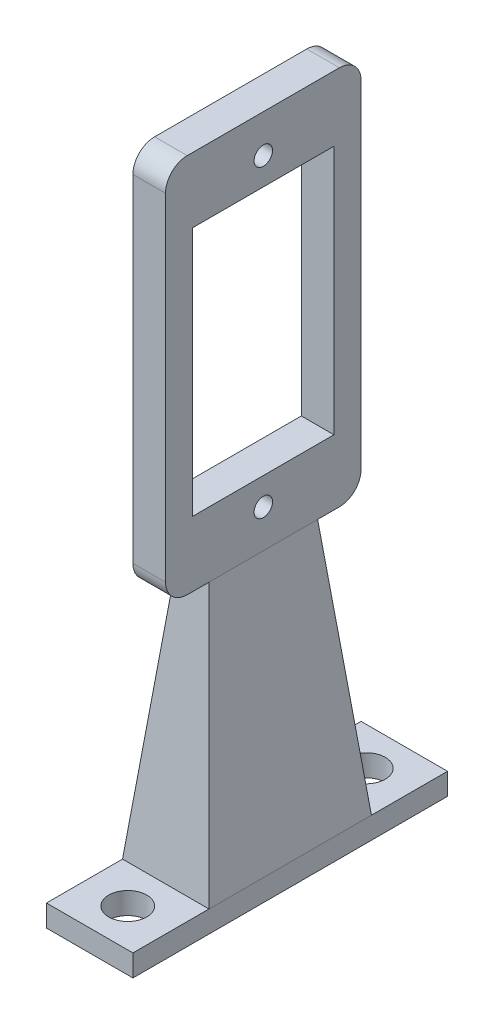
ISO-10303-21;
HEADER;
FILE_DESCRIPTION(('STEP AP214'),'2;1');
FILE_NAME('part.step','',(''),(''),'','','');
FILE_SCHEMA(('AUTOMOTIVE_DESIGN { 1 0 10303 214 1 1 1 1 }'));
ENDSEC;
DATA;
#1=APPLICATION_CONTEXT('core data for automotive mechanical design processes');
#2=APPLICATION_PROTOCOL_DEFINITION('international standard','automotive_design',2000,#1);
#3=PRODUCT_CONTEXT('',#1,'mechanical');
#4=PRODUCT('Part','Part','',(#3));
#5=PRODUCT_RELATED_PRODUCT_CATEGORY('part','',(#4));
#6=PRODUCT_DEFINITION_FORMATION('','',#4);
#7=PRODUCT_DEFINITION_CONTEXT('part definition',#1,'design');
#8=PRODUCT_DEFINITION('design','',#6,#7);
#9=PRODUCT_DEFINITION_SHAPE('','',#8);
#10=(LENGTH_UNIT() NAMED_UNIT(*) SI_UNIT(.MILLI.,.METRE.));
#11=(NAMED_UNIT(*) PLANE_ANGLE_UNIT() SI_UNIT($,.RADIAN.));
#12=(NAMED_UNIT(*) SI_UNIT($,.STERADIAN.) SOLID_ANGLE_UNIT());
#13=UNCERTAINTY_MEASURE_WITH_UNIT(LENGTH_MEASURE(1.E-05),#10,'distance_accuracy_value','');
#14=(GEOMETRIC_REPRESENTATION_CONTEXT(3) GLOBAL_UNCERTAINTY_ASSIGNED_CONTEXT((#13)) GLOBAL_UNIT_ASSIGNED_CONTEXT((#10,
#11,#12)) REPRESENTATION_CONTEXT('',''));
#15=CARTESIAN_POINT('',(0.,0.,0.));
#16=DIRECTION('',(0.,0.,1.));
#17=DIRECTION('',(1.,0.,0.));
#18=AXIS2_PLACEMENT_3D('',#15,#16,#17);
#19=CARTESIAN_POINT('',(1.5,-17.5,9.));
#20=DIRECTION('',(0.,1.,0.));
#21=DIRECTION('',(0.,0.,1.));
#22=AXIS2_PLACEMENT_3D('',#19,#20,#21);
#23=PLANE('',#22);
#24=DIRECTION('',(1.,0.,0.));
#25=VECTOR('',#24,1.);
#26=CARTESIAN_POINT('',(-1.5,-17.5,-5.));
#27=LINE('',#26,#25);
#28=CARTESIAN_POINT('',(-1.5,-17.5,-5.));
#29=VERTEX_POINT('',#28);
#30=CARTESIAN_POINT('',(1.5,-17.5,-5.));
#31=VERTEX_POINT('',#30);
#32=EDGE_CURVE('E201',#29,#31,#27,.T.);
#33=ORIENTED_EDGE('',*,*,#32,.F.);
#34=DIRECTION('',(0.,0.,-1.));
#35=VECTOR('',#34,1.);
#36=CARTESIAN_POINT('',(-1.5,-17.5,9.));
#37=LINE('',#36,#35);
#38=CARTESIAN_POINT('',(-1.5,-17.5,-7.));
#39=VERTEX_POINT('',#38);
#40=EDGE_CURVE('E302',#29,#39,#37,.T.);
#41=ORIENTED_EDGE('',*,*,#40,.T.);
#42=DIRECTION('',(-1.,0.,0.));
#43=VECTOR('',#42,1.);
#44=CARTESIAN_POINT('',(1.5,-17.5,-7.));
#45=LINE('',#44,#43);
#46=CARTESIAN_POINT('',(1.5,-17.5,-7.));
#47=VERTEX_POINT('',#46);
#48=EDGE_CURVE('E293',#39,#47,#45,.F.);
#49=ORIENTED_EDGE('',*,*,#48,.T.);
#50=DIRECTION('',(0.,0.,-1.));
#51=VECTOR('',#50,1.);
#52=CARTESIAN_POINT('',(1.5,-17.5,9.));
#53=LINE('',#52,#51);
#54=EDGE_CURVE('E47',#31,#47,#53,.T.);
#55=ORIENTED_EDGE('',*,*,#54,.F.);
#56=EDGE_LOOP('',(#33,#41,#49,#55));
#57=FACE_BOUND('',#56,.T.);
#58=ADVANCED_FACE('F32',(#57),#23,.F.);
#59=DIRECTION('',(-1.,0.,0.));
#60=VECTOR('',#59,1.);
#61=CARTESIAN_POINT('',(-1.5,-17.5,5.));
#62=LINE('',#61,#60);
#63=CARTESIAN_POINT('',(1.5,-17.5,5.));
#64=VERTEX_POINT('',#63);
#65=CARTESIAN_POINT('',(-1.5,-17.5,5.));
#66=VERTEX_POINT('',#65);
#67=EDGE_CURVE('E55',#64,#66,#62,.T.);
#68=ORIENTED_EDGE('',*,*,#67,.F.);
#69=CARTESIAN_POINT('',(1.5,-17.5,7.));
#70=VERTEX_POINT('',#69);
#71=EDGE_CURVE('E291',#70,#64,#53,.T.);
#72=ORIENTED_EDGE('',*,*,#71,.F.);
#73=DIRECTION('',(-1.,0.,0.));
#74=VECTOR('',#73,1.);
#75=CARTESIAN_POINT('',(1.5,-17.5,7.));
#76=LINE('',#75,#74);
#77=CARTESIAN_POINT('',(-1.5,-17.5,7.));
#78=VERTEX_POINT('',#77);
#79=EDGE_CURVE('E305',#70,#78,#76,.T.);
#80=ORIENTED_EDGE('',*,*,#79,.T.);
#81=EDGE_CURVE('E285',#78,#66,#37,.T.);
#82=ORIENTED_EDGE('',*,*,#81,.T.);
#83=EDGE_LOOP('',(#68,#72,#80,#82));
#84=FACE_BOUND('',#83,.T.);
#85=ADVANCED_FACE('F362',(#84),#23,.F.);
#86=CARTESIAN_POINT('',(1.5,-17.5,-9.));
#87=DIRECTION('',(0.,0.,1.));
#88=DIRECTION('',(1.,0.,0.));
#89=AXIS2_PLACEMENT_3D('',#86,#87,#88);
#90=PLANE('',#89);
#91=DIRECTION('',(0.,1.,0.));
#92=VECTOR('',#91,1.);
#93=CARTESIAN_POINT('',(1.5,-17.5,-9.));
#94=LINE('',#93,#92);
#95=CARTESIAN_POINT('',(1.5,-15.5,-9.));
#96=VERTEX_POINT('',#95);
#97=CARTESIAN_POINT('',(1.5,15.5,-9.));
#98=VERTEX_POINT('',#97);
#99=EDGE_CURVE('E281',#96,#98,#94,.T.);
#100=ORIENTED_EDGE('',*,*,#99,.F.);
#101=DIRECTION('',(-1.,0.,0.));
#102=VECTOR('',#101,1.);
#103=CARTESIAN_POINT('',(1.5,-15.5,-9.));
#104=LINE('',#103,#102);
#105=CARTESIAN_POINT('',(-1.5,-15.5,-9.));
#106=VERTEX_POINT('',#105);
#107=EDGE_CURVE('E332',#96,#106,#104,.T.);
#108=ORIENTED_EDGE('',*,*,#107,.T.);
#109=DIRECTION('',(0.,1.,0.));
#110=VECTOR('',#109,1.);
#111=CARTESIAN_POINT('',(-1.5,-17.5,-9.));
#112=LINE('',#111,#110);
#113=CARTESIAN_POINT('',(-1.5,15.5,-9.));
#114=VERTEX_POINT('',#113);
#115=EDGE_CURVE('E280',#106,#114,#112,.T.);
#116=ORIENTED_EDGE('',*,*,#115,.T.);
#117=DIRECTION('',(-1.,0.,0.));
#118=VECTOR('',#117,1.);
#119=CARTESIAN_POINT('',(1.5,15.5,-9.));
#120=LINE('',#119,#118);
#121=EDGE_CURVE('E330',#114,#98,#120,.F.);
#122=ORIENTED_EDGE('',*,*,#121,.T.);
#123=EDGE_LOOP('',(#100,#108,#116,#122));
#124=FACE_BOUND('',#123,.T.);
#125=ADVANCED_FACE('F410',(#124),#90,.F.);
#126=CARTESIAN_POINT('',(1.5,17.5,9.));
#127=DIRECTION('',(0.,-1.,0.));
#128=DIRECTION('',(0.,0.,-1.));
#129=AXIS2_PLACEMENT_3D('',#126,#127,#128);
#130=PLANE('',#129);
#131=DIRECTION('',(0.,0.,1.));
#132=VECTOR('',#131,1.);
#133=CARTESIAN_POINT('',(-1.5,17.5,9.));
#134=LINE('',#133,#132);
#135=CARTESIAN_POINT('',(-1.5,17.5,-7.));
#136=VERTEX_POINT('',#135);
#137=CARTESIAN_POINT('',(-1.5,17.5,7.));
#138=VERTEX_POINT('',#137);
#139=EDGE_CURVE('E296',#136,#138,#134,.T.);
#140=ORIENTED_EDGE('',*,*,#139,.T.);
#141=DIRECTION('',(-1.,0.,0.));
#142=VECTOR('',#141,1.);
#143=CARTESIAN_POINT('',(1.5,17.5,7.));
#144=LINE('',#143,#142);
#145=CARTESIAN_POINT('',(1.5,17.5,7.));
#146=VERTEX_POINT('',#145);
#147=EDGE_CURVE('E11',#138,#146,#144,.F.);
#148=ORIENTED_EDGE('',*,*,#147,.T.);
#149=DIRECTION('',(0.,0.,1.));
#150=VECTOR('',#149,1.);
#151=CARTESIAN_POINT('',(1.5,17.5,9.));
#152=LINE('',#151,#150);
#153=CARTESIAN_POINT('',(1.5,17.5,-7.));
#154=VERTEX_POINT('',#153);
#155=EDGE_CURVE('E284',#154,#146,#152,.T.);
#156=ORIENTED_EDGE('',*,*,#155,.F.);
#157=DIRECTION('',(-1.,0.,0.));
#158=VECTOR('',#157,1.);
#159=CARTESIAN_POINT('',(1.5,17.5,-7.));
#160=LINE('',#159,#158);
#161=EDGE_CURVE('E40',#154,#136,#160,.T.);
#162=ORIENTED_EDGE('',*,*,#161,.T.);
#163=EDGE_LOOP('',(#140,#148,#156,#162));
#164=FACE_BOUND('',#163,.T.);
#165=ADVANCED_FACE('F339',(#164),#130,.F.);
#166=CARTESIAN_POINT('',(1.5,-17.5,9.));
#167=DIRECTION('',(0.,0.,-1.));
#168=DIRECTION('',(-1.,0.,0.));
#169=AXIS2_PLACEMENT_3D('',#166,#167,#168);
#170=PLANE('',#169);
#171=DIRECTION('',(0.,-1.,0.));
#172=VECTOR('',#171,1.);
#173=CARTESIAN_POINT('',(-1.5,-17.5,9.));
#174=LINE('',#173,#172);
#175=CARTESIAN_POINT('',(-1.5,15.5,9.));
#176=VERTEX_POINT('',#175);
#177=CARTESIAN_POINT('',(-1.5,-15.5,9.));
#178=VERTEX_POINT('',#177);
#179=EDGE_CURVE('E299',#176,#178,#174,.T.);
#180=ORIENTED_EDGE('',*,*,#179,.T.);
#181=DIRECTION('',(-1.,0.,0.));
#182=VECTOR('',#181,1.);
#183=CARTESIAN_POINT('',(1.5,-15.5,9.));
#184=LINE('',#183,#182);
#185=CARTESIAN_POINT('',(1.5,-15.5,9.));
#186=VERTEX_POINT('',#185);
#187=EDGE_CURVE('E320',#178,#186,#184,.F.);
#188=ORIENTED_EDGE('',*,*,#187,.T.);
#189=DIRECTION('',(0.,-1.,0.));
#190=VECTOR('',#189,1.);
#191=CARTESIAN_POINT('',(1.5,-17.5,9.));
#192=LINE('',#191,#190);
#193=CARTESIAN_POINT('',(1.5,15.5,9.));
#194=VERTEX_POINT('',#193);
#195=EDGE_CURVE('E288',#194,#186,#192,.T.);
#196=ORIENTED_EDGE('',*,*,#195,.F.);
#197=DIRECTION('',(-1.,0.,0.));
#198=VECTOR('',#197,1.);
#199=CARTESIAN_POINT('',(1.5,15.5,9.));
#200=LINE('',#199,#198);
#201=EDGE_CURVE('E317',#194,#176,#200,.T.);
#202=ORIENTED_EDGE('',*,*,#201,.T.);
#203=EDGE_LOOP('',(#180,#188,#196,#202));
#204=FACE_BOUND('',#203,.T.);
#205=ADVANCED_FACE('F354',(#204),#170,.F.);
#206=CARTESIAN_POINT('',(1.5,0.,0.));
#207=DIRECTION('',(-1.,0.,0.));
#208=DIRECTION('',(0.,0.,1.));
#209=AXIS2_PLACEMENT_3D('',#206,#207,#208);
#210=PLANE('',#209);
#211=CARTESIAN_POINT('',(1.5,-14.,0.));
#212=DIRECTION('',(-1.,0.,0.));
#213=DIRECTION('',(0.,0.,1.));
#214=AXIS2_PLACEMENT_3D('',#211,#212,#213);
#215=CIRCLE('',#214,0.85);
#216=CARTESIAN_POINT('',(1.5,-14.,0.85));
#217=VERTEX_POINT('',#216);
#218=EDGE_CURVE('E239',#217,#217,#215,.F.);
#219=ORIENTED_EDGE('',*,*,#218,.F.);
#220=EDGE_LOOP('',(#219));
#221=FACE_BOUND('',#220,.T.);
#222=CARTESIAN_POINT('',(1.5,14.,0.));
#223=DIRECTION('',(-1.,0.,0.));
#224=DIRECTION('',(0.,0.,1.));
#225=AXIS2_PLACEMENT_3D('',#222,#223,#224);
#226=CIRCLE('',#225,0.85);
#227=CARTESIAN_POINT('',(1.5,14.,0.85));
#228=VERTEX_POINT('',#227);
#229=EDGE_CURVE('E245',#228,#228,#226,.F.);
#230=ORIENTED_EDGE('',*,*,#229,.F.);
#231=EDGE_LOOP('',(#230));
#232=FACE_BOUND('',#231,.T.);
#233=DIRECTION('',(0.,0.,-1.));
#234=VECTOR('',#233,1.);
#235=CARTESIAN_POINT('',(1.5,-11.5,-6.5));
#236=LINE('',#235,#234);
#237=CARTESIAN_POINT('',(1.5,-11.5,6.5));
#238=VERTEX_POINT('',#237);
#239=CARTESIAN_POINT('',(1.5,-11.5,-6.5));
#240=VERTEX_POINT('',#239);
#241=EDGE_CURVE('E259',#238,#240,#236,.T.);
#242=ORIENTED_EDGE('',*,*,#241,.F.);
#243=DIRECTION('',(0.,-1.,0.));
#244=VECTOR('',#243,1.);
#245=CARTESIAN_POINT('',(1.5,-11.5,6.5));
#246=LINE('',#245,#244);
#247=CARTESIAN_POINT('',(1.5,11.5,6.5));
#248=VERTEX_POINT('',#247);
#249=EDGE_CURVE('E257',#248,#238,#246,.T.);
#250=ORIENTED_EDGE('',*,*,#249,.F.);
#251=DIRECTION('',(0.,0.,1.));
#252=VECTOR('',#251,1.);
#253=CARTESIAN_POINT('',(1.5,11.5,-6.5));
#254=LINE('',#253,#252);
#255=CARTESIAN_POINT('',(1.5,11.5,-6.5));
#256=VERTEX_POINT('',#255);
#257=EDGE_CURVE('E265',#256,#248,#254,.T.);
#258=ORIENTED_EDGE('',*,*,#257,.F.);
#259=DIRECTION('',(0.,1.,0.));
#260=VECTOR('',#259,1.);
#261=CARTESIAN_POINT('',(1.5,-11.5,-6.5));
#262=LINE('',#261,#260);
#263=EDGE_CURVE('E262',#240,#256,#262,.T.);
#264=ORIENTED_EDGE('',*,*,#263,.F.);
#265=EDGE_LOOP('',(#242,#250,#258,#264));
#266=FACE_BOUND('',#265,.T.);
#267=ORIENTED_EDGE('',*,*,#195,.T.);
#268=CARTESIAN_POINT('',(1.5,-15.5,7.));
#269=DIRECTION('',(-1.,0.,0.));
#270=DIRECTION('',(0.,0.,1.));
#271=AXIS2_PLACEMENT_3D('',#268,#269,#270);
#272=CIRCLE('',#271,2.);
#273=EDGE_CURVE('E328',#186,#70,#272,.F.);
#274=ORIENTED_EDGE('',*,*,#273,.T.);
#275=ORIENTED_EDGE('',*,*,#71,.T.);
#276=DIRECTION('',(0.,0.,1.));
#277=VECTOR('',#276,1.);
#278=CARTESIAN_POINT('',(1.5,-17.5,-5.));
#279=LINE('',#278,#277);
#280=EDGE_CURVE('E209',#31,#64,#279,.T.);
#281=ORIENTED_EDGE('',*,*,#280,.F.);
#282=ORIENTED_EDGE('',*,*,#54,.T.);
#283=CARTESIAN_POINT('',(1.5,-15.5,-7.));
#284=DIRECTION('',(-1.,0.,0.));
#285=DIRECTION('',(0.,0.,1.));
#286=AXIS2_PLACEMENT_3D('',#283,#284,#285);
#287=CIRCLE('',#286,2.);
#288=EDGE_CURVE('E326',#47,#96,#287,.F.);
#289=ORIENTED_EDGE('',*,*,#288,.T.);
#290=ORIENTED_EDGE('',*,*,#99,.T.);
#291=CARTESIAN_POINT('',(1.5,15.5,-7.));
#292=DIRECTION('',(-1.,0.,0.));
#293=DIRECTION('',(0.,0.,1.));
#294=AXIS2_PLACEMENT_3D('',#291,#292,#293);
#295=CIRCLE('',#294,2.);
#296=EDGE_CURVE('E322',#98,#154,#295,.F.);
#297=ORIENTED_EDGE('',*,*,#296,.T.);
#298=ORIENTED_EDGE('',*,*,#155,.T.);
#299=CARTESIAN_POINT('',(1.5,15.5,7.));
#300=DIRECTION('',(-1.,0.,0.));
#301=DIRECTION('',(0.,0.,1.));
#302=AXIS2_PLACEMENT_3D('',#299,#300,#301);
#303=CIRCLE('',#302,2.);
#304=EDGE_CURVE('E324',#146,#194,#303,.F.);
#305=ORIENTED_EDGE('',*,*,#304,.T.);
#306=EDGE_LOOP('',(#267,#274,#275,#281,#282,#289,#290,#297,#298,#305));
#307=FACE_BOUND('',#306,.T.);
#308=ADVANCED_FACE('F358',(#221,#232,#266,#307),#210,.F.);
#309=CARTESIAN_POINT('',(-1.5,0.,0.));
#310=DIRECTION('',(-1.,0.,0.));
#311=DIRECTION('',(0.,0.,1.));
#312=AXIS2_PLACEMENT_3D('',#309,#310,#311);
#313=PLANE('',#312);
#314=CARTESIAN_POINT('',(-1.5,-14.,0.));
#315=DIRECTION('',(-1.,0.,0.));
#316=DIRECTION('',(0.,0.,1.));
#317=AXIS2_PLACEMENT_3D('',#314,#315,#316);
#318=CIRCLE('',#317,0.85);
#319=CARTESIAN_POINT('',(-1.5,-14.,0.85));
#320=VERTEX_POINT('',#319);
#321=EDGE_CURVE('E217',#320,#320,#318,.T.);
#322=ORIENTED_EDGE('',*,*,#321,.F.);
#323=EDGE_LOOP('',(#322));
#324=FACE_BOUND('',#323,.T.);
#325=CARTESIAN_POINT('',(-1.5,14.,0.));
#326=DIRECTION('',(-1.,0.,0.));
#327=DIRECTION('',(0.,0.,1.));
#328=AXIS2_PLACEMENT_3D('',#325,#326,#327);
#329=CIRCLE('',#328,0.85);
#330=CARTESIAN_POINT('',(-1.5,14.,0.85));
#331=VERTEX_POINT('',#330);
#332=EDGE_CURVE('E242',#331,#331,#329,.T.);
#333=ORIENTED_EDGE('',*,*,#332,.F.);
#334=EDGE_LOOP('',(#333));
#335=FACE_BOUND('',#334,.T.);
#336=DIRECTION('',(0.,-1.,0.));
#337=VECTOR('',#336,1.);
#338=CARTESIAN_POINT('',(-1.5,-11.5,6.5));
#339=LINE('',#338,#337);
#340=CARTESIAN_POINT('',(-1.5,11.5,6.5));
#341=VERTEX_POINT('',#340);
#342=CARTESIAN_POINT('',(-1.5,-11.5,6.5));
#343=VERTEX_POINT('',#342);
#344=EDGE_CURVE('E254',#341,#343,#339,.T.);
#345=ORIENTED_EDGE('',*,*,#344,.T.);
#346=DIRECTION('',(0.,0.,-1.));
#347=VECTOR('',#346,1.);
#348=CARTESIAN_POINT('',(-1.5,-11.5,-6.5));
#349=LINE('',#348,#347);
#350=CARTESIAN_POINT('',(-1.5,-11.5,-6.5));
#351=VERTEX_POINT('',#350);
#352=EDGE_CURVE('E271',#343,#351,#349,.T.);
#353=ORIENTED_EDGE('',*,*,#352,.T.);
#354=DIRECTION('',(0.,1.,0.));
#355=VECTOR('',#354,1.);
#356=CARTESIAN_POINT('',(-1.5,-11.5,-6.5));
#357=LINE('',#356,#355);
#358=CARTESIAN_POINT('',(-1.5,11.5,-6.5));
#359=VERTEX_POINT('',#358);
#360=EDGE_CURVE('E248',#351,#359,#357,.T.);
#361=ORIENTED_EDGE('',*,*,#360,.T.);
#362=DIRECTION('',(0.,0.,1.));
#363=VECTOR('',#362,1.);
#364=CARTESIAN_POINT('',(-1.5,11.5,-6.5));
#365=LINE('',#364,#363);
#366=EDGE_CURVE('E251',#359,#341,#365,.T.);
#367=ORIENTED_EDGE('',*,*,#366,.T.);
#368=EDGE_LOOP('',(#345,#353,#361,#367));
#369=FACE_BOUND('',#368,.T.);
#370=ORIENTED_EDGE('',*,*,#81,.F.);
#371=CARTESIAN_POINT('',(-1.5,-15.5,7.));
#372=DIRECTION('',(-1.,0.,0.));
#373=DIRECTION('',(0.,0.,1.));
#374=AXIS2_PLACEMENT_3D('',#371,#372,#373);
#375=CIRCLE('',#374,2.);
#376=EDGE_CURVE('E315',#78,#178,#375,.T.);
#377=ORIENTED_EDGE('',*,*,#376,.T.);
#378=ORIENTED_EDGE('',*,*,#179,.F.);
#379=CARTESIAN_POINT('',(-1.5,15.5,7.));
#380=DIRECTION('',(-1.,0.,0.));
#381=DIRECTION('',(0.,0.,1.));
#382=AXIS2_PLACEMENT_3D('',#379,#380,#381);
#383=CIRCLE('',#382,2.);
#384=EDGE_CURVE('E310',#176,#138,#383,.T.);
#385=ORIENTED_EDGE('',*,*,#384,.T.);
#386=ORIENTED_EDGE('',*,*,#139,.F.);
#387=CARTESIAN_POINT('',(-1.5,15.5,-7.));
#388=DIRECTION('',(-1.,0.,0.));
#389=DIRECTION('',(0.,0.,1.));
#390=AXIS2_PLACEMENT_3D('',#387,#388,#389);
#391=CIRCLE('',#390,2.);
#392=EDGE_CURVE('E308',#136,#114,#391,.T.);
#393=ORIENTED_EDGE('',*,*,#392,.T.);
#394=ORIENTED_EDGE('',*,*,#115,.F.);
#395=CARTESIAN_POINT('',(-1.5,-15.5,-7.));
#396=DIRECTION('',(-1.,0.,0.));
#397=DIRECTION('',(0.,0.,1.));
#398=AXIS2_PLACEMENT_3D('',#395,#396,#397);
#399=CIRCLE('',#398,2.);
#400=EDGE_CURVE('E312',#106,#39,#399,.T.);
#401=ORIENTED_EDGE('',*,*,#400,.T.);
#402=ORIENTED_EDGE('',*,*,#40,.F.);
#403=DIRECTION('',(0.,0.,-1.));
#404=VECTOR('',#403,1.);
#405=CARTESIAN_POINT('',(-1.5,-17.5,-5.));
#406=LINE('',#405,#404);
#407=EDGE_CURVE('E198',#66,#29,#406,.T.);
#408=ORIENTED_EDGE('',*,*,#407,.F.);
#409=EDGE_LOOP('',(#370,#377,#378,#385,#386,#393,#394,#401,#402,#408));
#410=FACE_BOUND('',#409,.T.);
#411=ADVANCED_FACE('F345',(#324,#335,#369,#410),#313,.T.);
#412=CARTESIAN_POINT('',(-1.501,-11.5,6.5));
#413=DIRECTION('',(0.,0.,1.));
#414=DIRECTION('',(1.,0.,0.));
#415=AXIS2_PLACEMENT_3D('',#412,#413,#414);
#416=PLANE('',#415);
#417=DIRECTION('',(1.,0.,0.));
#418=VECTOR('',#417,1.);
#419=CARTESIAN_POINT('',(-1.501,11.5,6.5));
#420=LINE('',#419,#418);
#421=EDGE_CURVE('E269',#341,#248,#420,.T.);
#422=ORIENTED_EDGE('',*,*,#421,.T.);
#423=ORIENTED_EDGE('',*,*,#249,.T.);
#424=DIRECTION('',(1.,0.,0.));
#425=VECTOR('',#424,1.);
#426=CARTESIAN_POINT('',(-1.501,-11.5,6.5));
#427=LINE('',#426,#425);
#428=EDGE_CURVE('E268',#343,#238,#427,.T.);
#429=ORIENTED_EDGE('',*,*,#428,.F.);
#430=ORIENTED_EDGE('',*,*,#344,.F.);
#431=EDGE_LOOP('',(#422,#423,#429,#430));
#432=FACE_BOUND('',#431,.T.);
#433=ADVANCED_FACE('F478',(#432),#416,.F.);
#434=CARTESIAN_POINT('',(-1.501,11.5,-6.5));
#435=DIRECTION('',(0.,1.,0.));
#436=DIRECTION('',(0.,0.,1.));
#437=AXIS2_PLACEMENT_3D('',#434,#435,#436);
#438=PLANE('',#437);
#439=DIRECTION('',(1.,0.,0.));
#440=VECTOR('',#439,1.);
#441=CARTESIAN_POINT('',(-1.501,11.5,-6.5));
#442=LINE('',#441,#440);
#443=EDGE_CURVE('E272',#359,#256,#442,.T.);
#444=ORIENTED_EDGE('',*,*,#443,.T.);
#445=ORIENTED_EDGE('',*,*,#257,.T.);
#446=ORIENTED_EDGE('',*,*,#421,.F.);
#447=ORIENTED_EDGE('',*,*,#366,.F.);
#448=EDGE_LOOP('',(#444,#445,#446,#447));
#449=FACE_BOUND('',#448,.T.);
#450=ADVANCED_FACE('F601',(#449),#438,.F.);
#451=CARTESIAN_POINT('',(-1.501,-11.5,-6.5));
#452=DIRECTION('',(0.,0.,-1.));
#453=DIRECTION('',(-1.,0.,0.));
#454=AXIS2_PLACEMENT_3D('',#451,#452,#453);
#455=PLANE('',#454);
#456=DIRECTION('',(1.,0.,0.));
#457=VECTOR('',#456,1.);
#458=CARTESIAN_POINT('',(-1.501,-11.5,-6.5));
#459=LINE('',#458,#457);
#460=EDGE_CURVE('E274',#351,#240,#459,.T.);
#461=ORIENTED_EDGE('',*,*,#460,.T.);
#462=ORIENTED_EDGE('',*,*,#263,.T.);
#463=ORIENTED_EDGE('',*,*,#443,.F.);
#464=ORIENTED_EDGE('',*,*,#360,.F.);
#465=EDGE_LOOP('',(#461,#462,#463,#464));
#466=FACE_BOUND('',#465,.T.);
#467=ADVANCED_FACE('F604',(#466),#455,.F.);
#468=CARTESIAN_POINT('',(-1.501,-11.5,-6.5));
#469=DIRECTION('',(0.,-1.,0.));
#470=DIRECTION('',(0.,0.,-1.));
#471=AXIS2_PLACEMENT_3D('',#468,#469,#470);
#472=PLANE('',#471);
#473=ORIENTED_EDGE('',*,*,#428,.T.);
#474=ORIENTED_EDGE('',*,*,#241,.T.);
#475=ORIENTED_EDGE('',*,*,#460,.F.);
#476=ORIENTED_EDGE('',*,*,#352,.F.);
#477=EDGE_LOOP('',(#473,#474,#475,#476));
#478=FACE_BOUND('',#477,.T.);
#479=ADVANCED_FACE('F599',(#478),#472,.F.);
#480=CARTESIAN_POINT('',(1.501,14.,0.));
#481=DIRECTION('',(-1.,0.,0.));
#482=DIRECTION('',(0.,0.,1.));
#483=AXIS2_PLACEMENT_3D('',#480,#481,#482);
#484=CYLINDRICAL_SURFACE('',#483,0.85);
#485=CARTESIAN_POINT('',(-1.5,14.,0.85));
#486=CARTESIAN_POINT('',(-1.46875,14.,0.85));
#487=CARTESIAN_POINT('',(-1.4375,14.,0.85));
#488=CARTESIAN_POINT('',(-1.375,14.,0.85));
#489=CARTESIAN_POINT('',(-1.34375,14.,0.85));
#490=CARTESIAN_POINT('',(-1.28125,14.,0.85));
#491=CARTESIAN_POINT('',(-1.25,14.,0.85));
#492=CARTESIAN_POINT('',(-1.1875,14.,0.85));
#493=CARTESIAN_POINT('',(-1.15625,14.,0.85));
#494=CARTESIAN_POINT('',(-1.09375,14.,0.85));
#495=CARTESIAN_POINT('',(-1.0625,14.,0.85));
#496=CARTESIAN_POINT('',(-1.,14.,0.85));
#497=CARTESIAN_POINT('',(-0.96875,14.,0.85));
#498=CARTESIAN_POINT('',(-0.90625,14.,0.85));
#499=CARTESIAN_POINT('',(-0.874999999999999,14.,0.85));
#500=CARTESIAN_POINT('',(-0.8125,14.,0.85));
#501=CARTESIAN_POINT('',(-0.78125,14.,0.85));
#502=CARTESIAN_POINT('',(-0.71875,14.,0.85));
#503=CARTESIAN_POINT('',(-0.6875,14.,0.85));
#504=CARTESIAN_POINT('',(-0.625,14.,0.85));
#505=CARTESIAN_POINT('',(-0.59375,14.,0.85));
#506=CARTESIAN_POINT('',(-0.53125,14.,0.85));
#507=CARTESIAN_POINT('',(-0.5,14.,0.85));
#508=CARTESIAN_POINT('',(-0.4375,14.,0.85));
#509=CARTESIAN_POINT('',(-0.40625,14.,0.85));
#510=CARTESIAN_POINT('',(-0.34375,14.,0.85));
#511=CARTESIAN_POINT('',(-0.3125,14.,0.85));
#512=CARTESIAN_POINT('',(-0.25,14.,0.85));
#513=CARTESIAN_POINT('',(-0.21875,14.,0.85));
#514=CARTESIAN_POINT('',(-0.15625,14.,0.85));
#515=CARTESIAN_POINT('',(-0.125,14.,0.85));
#516=CARTESIAN_POINT('',(-0.0624999999999998,14.,0.85));
#517=CARTESIAN_POINT('',(-0.0312499999999998,14.,0.85));
#518=CARTESIAN_POINT('',(0.0312500000000002,14.,0.85));
#519=CARTESIAN_POINT('',(0.0625000000000003,14.,0.85));
#520=CARTESIAN_POINT('',(0.125,14.,0.85));
#521=CARTESIAN_POINT('',(0.15625,14.,0.85));
#522=CARTESIAN_POINT('',(0.21875,14.,0.85));
#523=CARTESIAN_POINT('',(0.25,14.,0.85));
#524=CARTESIAN_POINT('',(0.3125,14.,0.85));
#525=CARTESIAN_POINT('',(0.34375,14.,0.85));
#526=CARTESIAN_POINT('',(0.40625,14.,0.85));
#527=CARTESIAN_POINT('',(0.4375,14.,0.85));
#528=CARTESIAN_POINT('',(0.5,14.,0.85));
#529=CARTESIAN_POINT('',(0.53125,14.,0.85));
#530=CARTESIAN_POINT('',(0.59375,14.,0.85));
#531=CARTESIAN_POINT('',(0.625,14.,0.85));
#532=CARTESIAN_POINT('',(0.6875,14.,0.85));
#533=CARTESIAN_POINT('',(0.71875,14.,0.85));
#534=CARTESIAN_POINT('',(0.78125,14.,0.85));
#535=CARTESIAN_POINT('',(0.8125,14.,0.85));
#536=CARTESIAN_POINT('',(0.875,14.,0.85));
#537=CARTESIAN_POINT('',(0.90625,14.,0.85));
#538=CARTESIAN_POINT('',(0.96875,14.,0.85));
#539=CARTESIAN_POINT('',(1.,14.,0.85));
#540=CARTESIAN_POINT('',(1.0625,14.,0.85));
#541=CARTESIAN_POINT('',(1.09375,14.,0.85));
#542=CARTESIAN_POINT('',(1.15625,14.,0.85));
#543=CARTESIAN_POINT('',(1.1875,14.,0.85));
#544=CARTESIAN_POINT('',(1.25,14.,0.85));
#545=CARTESIAN_POINT('',(1.28125,14.,0.85));
#546=CARTESIAN_POINT('',(1.34375,14.,0.85));
#547=CARTESIAN_POINT('',(1.375,14.,0.85));
#548=CARTESIAN_POINT('',(1.4375,14.,0.85));
#549=CARTESIAN_POINT('',(1.46875,14.,0.85));
#550=CARTESIAN_POINT('',(1.5,14.,0.85));
#551=B_SPLINE_CURVE_WITH_KNOTS('',3,(#485,#486,#487,#488,#489,#490,#491,#492,#493,#494,#495,
#496,#497,#498,#499,#500,#501,#502,#503,#504,#505,#506,#507,#508,#509,#510,#511,#512,#513,#514,
#515,#516,#517,#518,#519,#520,#521,#522,#523,#524,#525,#526,#527,#528,#529,#530,#531,#532,#533,
#534,#535,#536,#537,#538,#539,#540,#541,#542,#543,#544,#545,#546,#547,#548,#549,#550),
.UNSPECIFIED.,.F.,.F.,(4,2,2,2,2,2,2,2,2,2,2,2,2,2,2,2,2,2,2,2,2,2,2,2,2,2,2,2,2,2,2,2,4),(0.,
0.0937500000000001,0.1875,0.28125,0.375,0.46875,0.5625,0.65625,0.75,0.84375,0.9375,1.03125,
1.125,1.21875,1.3125,1.40625,1.5,1.59375,1.6875,1.78125,1.875,1.96875,2.0625,2.15625,2.25,
2.34375,2.4375,2.53125,2.625,2.71875,2.8125,2.90625,3.),.UNSPECIFIED.);
#552=EDGE_CURVE('BSEAM595',#331,#228,#551,.T.);
#553=ORIENTED_EDGE('',*,*,#332,.T.);
#554=ORIENTED_EDGE('',*,*,#229,.T.);
#555=ORIENTED_EDGE('',*,*,#552,.T.);
#556=ORIENTED_EDGE('',*,*,#552,.F.);
#557=EDGE_LOOP('',(#553,#555,#554,#556));
#558=FACE_BOUND('',#557,.T.);
#559=ADVANCED_FACE('F595',(#558),#484,.F.);
#560=CARTESIAN_POINT('',(1.501,-14.,0.));
#561=DIRECTION('',(-1.,0.,0.));
#562=DIRECTION('',(0.,0.,1.));
#563=AXIS2_PLACEMENT_3D('',#560,#561,#562);
#564=CYLINDRICAL_SURFACE('',#563,0.85);
#565=CARTESIAN_POINT('',(-1.5,-14.,0.85));
#566=CARTESIAN_POINT('',(-1.46875,-14.,0.85));
#567=CARTESIAN_POINT('',(-1.4375,-14.,0.85));
#568=CARTESIAN_POINT('',(-1.375,-14.,0.85));
#569=CARTESIAN_POINT('',(-1.34375,-14.,0.85));
#570=CARTESIAN_POINT('',(-1.28125,-14.,0.85));
#571=CARTESIAN_POINT('',(-1.25,-14.,0.85));
#572=CARTESIAN_POINT('',(-1.1875,-14.,0.85));
#573=CARTESIAN_POINT('',(-1.15625,-14.,0.85));
#574=CARTESIAN_POINT('',(-1.09375,-14.,0.85));
#575=CARTESIAN_POINT('',(-1.0625,-14.,0.85));
#576=CARTESIAN_POINT('',(-1.,-14.,0.85));
#577=CARTESIAN_POINT('',(-0.96875,-14.,0.85));
#578=CARTESIAN_POINT('',(-0.90625,-14.,0.85));
#579=CARTESIAN_POINT('',(-0.874999999999999,-14.,0.85));
#580=CARTESIAN_POINT('',(-0.8125,-14.,0.85));
#581=CARTESIAN_POINT('',(-0.78125,-14.,0.85));
#582=CARTESIAN_POINT('',(-0.71875,-14.,0.85));
#583=CARTESIAN_POINT('',(-0.6875,-14.,0.85));
#584=CARTESIAN_POINT('',(-0.625,-14.,0.85));
#585=CARTESIAN_POINT('',(-0.59375,-14.,0.85));
#586=CARTESIAN_POINT('',(-0.53125,-14.,0.85));
#587=CARTESIAN_POINT('',(-0.5,-14.,0.85));
#588=CARTESIAN_POINT('',(-0.4375,-14.,0.85));
#589=CARTESIAN_POINT('',(-0.40625,-14.,0.85));
#590=CARTESIAN_POINT('',(-0.34375,-14.,0.85));
#591=CARTESIAN_POINT('',(-0.3125,-14.,0.85));
#592=CARTESIAN_POINT('',(-0.25,-14.,0.85));
#593=CARTESIAN_POINT('',(-0.21875,-14.,0.85));
#594=CARTESIAN_POINT('',(-0.15625,-14.,0.85));
#595=CARTESIAN_POINT('',(-0.125,-14.,0.85));
#596=CARTESIAN_POINT('',(-0.0624999999999998,-14.,0.85));
#597=CARTESIAN_POINT('',(-0.0312499999999998,-14.,0.85));
#598=CARTESIAN_POINT('',(0.0312500000000002,-14.,0.85));
#599=CARTESIAN_POINT('',(0.0625000000000003,-14.,0.85));
#600=CARTESIAN_POINT('',(0.125,-14.,0.85));
#601=CARTESIAN_POINT('',(0.15625,-14.,0.85));
#602=CARTESIAN_POINT('',(0.21875,-14.,0.85));
#603=CARTESIAN_POINT('',(0.25,-14.,0.85));
#604=CARTESIAN_POINT('',(0.3125,-14.,0.85));
#605=CARTESIAN_POINT('',(0.34375,-14.,0.85));
#606=CARTESIAN_POINT('',(0.40625,-14.,0.85));
#607=CARTESIAN_POINT('',(0.4375,-14.,0.85));
#608=CARTESIAN_POINT('',(0.5,-14.,0.85));
#609=CARTESIAN_POINT('',(0.53125,-14.,0.85));
#610=CARTESIAN_POINT('',(0.59375,-14.,0.85));
#611=CARTESIAN_POINT('',(0.625,-14.,0.85));
#612=CARTESIAN_POINT('',(0.6875,-14.,0.85));
#613=CARTESIAN_POINT('',(0.71875,-14.,0.85));
#614=CARTESIAN_POINT('',(0.78125,-14.,0.85));
#615=CARTESIAN_POINT('',(0.8125,-14.,0.85));
#616=CARTESIAN_POINT('',(0.875,-14.,0.85));
#617=CARTESIAN_POINT('',(0.90625,-14.,0.85));
#618=CARTESIAN_POINT('',(0.96875,-14.,0.85));
#619=CARTESIAN_POINT('',(1.,-14.,0.85));
#620=CARTESIAN_POINT('',(1.0625,-14.,0.85));
#621=CARTESIAN_POINT('',(1.09375,-14.,0.85));
#622=CARTESIAN_POINT('',(1.15625,-14.,0.85));
#623=CARTESIAN_POINT('',(1.1875,-14.,0.85));
#624=CARTESIAN_POINT('',(1.25,-14.,0.85));
#625=CARTESIAN_POINT('',(1.28125,-14.,0.85));
#626=CARTESIAN_POINT('',(1.34375,-14.,0.85));
#627=CARTESIAN_POINT('',(1.375,-14.,0.85));
#628=CARTESIAN_POINT('',(1.4375,-14.,0.85));
#629=CARTESIAN_POINT('',(1.46875,-14.,0.85));
#630=CARTESIAN_POINT('',(1.5,-14.,0.85));
#631=B_SPLINE_CURVE_WITH_KNOTS('',3,(#565,#566,#567,#568,#569,#570,#571,#572,#573,#574,#575,
#576,#577,#578,#579,#580,#581,#582,#583,#584,#585,#586,#587,#588,#589,#590,#591,#592,#593,#594,
#595,#596,#597,#598,#599,#600,#601,#602,#603,#604,#605,#606,#607,#608,#609,#610,#611,#612,#613,
#614,#615,#616,#617,#618,#619,#620,#621,#622,#623,#624,#625,#626,#627,#628,#629,#630),
.UNSPECIFIED.,.F.,.F.,(4,2,2,2,2,2,2,2,2,2,2,2,2,2,2,2,2,2,2,2,2,2,2,2,2,2,2,2,2,2,2,2,4),(0.,
0.0937500000000001,0.1875,0.28125,0.375,0.46875,0.5625,0.65625,0.75,0.84375,0.9375,1.03125,
1.125,1.21875,1.3125,1.40625,1.5,1.59375,1.6875,1.78125,1.875,1.96875,2.0625,2.15625,2.25,
2.34375,2.4375,2.53125,2.625,2.71875,2.8125,2.90625,3.),.UNSPECIFIED.);
#632=EDGE_CURVE('BSEAM434',#320,#217,#631,.T.);
#633=ORIENTED_EDGE('',*,*,#321,.T.);
#634=ORIENTED_EDGE('',*,*,#218,.T.);
#635=ORIENTED_EDGE('',*,*,#632,.T.);
#636=ORIENTED_EDGE('',*,*,#632,.F.);
#637=EDGE_LOOP('',(#633,#635,#634,#636));
#638=FACE_BOUND('',#637,.T.);
#639=ADVANCED_FACE('F434',(#638),#564,.F.);
#640=CARTESIAN_POINT('',(1.5,-15.5,7.));
#641=DIRECTION('',(-1.,0.,0.));
#642=DIRECTION('',(0.,0.,1.));
#643=AXIS2_PLACEMENT_3D('',#640,#641,#642);
#644=CYLINDRICAL_SURFACE('',#643,2.);
#645=ORIENTED_EDGE('',*,*,#273,.F.);
#646=ORIENTED_EDGE('',*,*,#187,.F.);
#647=ORIENTED_EDGE('',*,*,#376,.F.);
#648=ORIENTED_EDGE('',*,*,#79,.F.);
#649=EDGE_LOOP('',(#645,#646,#647,#648));
#650=FACE_BOUND('',#649,.T.);
#651=ADVANCED_FACE('F361',(#650),#644,.T.);
#652=CARTESIAN_POINT('',(1.5,-15.5,-7.));
#653=DIRECTION('',(-1.,0.,0.));
#654=DIRECTION('',(0.,0.,1.));
#655=AXIS2_PLACEMENT_3D('',#652,#653,#654);
#656=CYLINDRICAL_SURFACE('',#655,2.);
#657=ORIENTED_EDGE('',*,*,#288,.F.);
#658=ORIENTED_EDGE('',*,*,#48,.F.);
#659=ORIENTED_EDGE('',*,*,#400,.F.);
#660=ORIENTED_EDGE('',*,*,#107,.F.);
#661=EDGE_LOOP('',(#657,#658,#659,#660));
#662=FACE_BOUND('',#661,.T.);
#663=ADVANCED_FACE('F407',(#662),#656,.T.);
#664=CARTESIAN_POINT('',(1.5,15.5,7.));
#665=DIRECTION('',(-1.,0.,0.));
#666=DIRECTION('',(0.,0.,1.));
#667=AXIS2_PLACEMENT_3D('',#664,#665,#666);
#668=CYLINDRICAL_SURFACE('',#667,2.);
#669=ORIENTED_EDGE('',*,*,#304,.F.);
#670=ORIENTED_EDGE('',*,*,#147,.F.);
#671=ORIENTED_EDGE('',*,*,#384,.F.);
#672=ORIENTED_EDGE('',*,*,#201,.F.);
#673=EDGE_LOOP('',(#669,#670,#671,#672));
#674=FACE_BOUND('',#673,.T.);
#675=ADVANCED_FACE('F351',(#674),#668,.T.);
#676=CARTESIAN_POINT('',(1.5,15.5,-7.));
#677=DIRECTION('',(-1.,0.,0.));
#678=DIRECTION('',(0.,0.,1.));
#679=AXIS2_PLACEMENT_3D('',#676,#677,#678);
#680=CYLINDRICAL_SURFACE('',#679,2.);
#681=ORIENTED_EDGE('',*,*,#296,.F.);
#682=ORIENTED_EDGE('',*,*,#121,.F.);
#683=ORIENTED_EDGE('',*,*,#392,.F.);
#684=ORIENTED_EDGE('',*,*,#161,.F.);
#685=EDGE_LOOP('',(#681,#682,#683,#684));
#686=FACE_BOUND('',#685,.T.);
#687=ADVANCED_FACE('F34',(#686),#680,.T.);
#688=CARTESIAN_POINT('',(-1.5,-17.5,-5.));
#689=DIRECTION('',(-0.994521895368273,0.104528463267654,0.));
#690=DIRECTION('',(-0.104528463267654,-0.994521895368273,0.));
#691=AXIS2_PLACEMENT_3D('',#688,#689,#690);
#692=PLANE('',#691);
#693=ORIENTED_EDGE('',*,*,#407,.T.);
#694=DIRECTION('',(0.103962051184498,0.989132844377854,0.103962051184498));
#695=VECTOR('',#694,1.);
#696=CARTESIAN_POINT('',(-1.5,-17.5,-5.));
#697=LINE('',#696,#695);
#698=CARTESIAN_POINT('',(-3.977306825212,-41.07,-7.477306825212));
#699=VERTEX_POINT('',#698);
#700=EDGE_CURVE('E214',#699,#29,#697,.T.);
#701=ORIENTED_EDGE('',*,*,#700,.F.);
#702=DIRECTION('',(0.,0.,1.));
#703=VECTOR('',#702,1.);
#704=CARTESIAN_POINT('',(-3.977306825212,-41.07,0.));
#705=LINE('',#704,#703);
#706=CARTESIAN_POINT('',(-3.977306825212,-41.07,7.477306825212));
#707=VERTEX_POINT('',#706);
#708=EDGE_CURVE('E213',#707,#699,#705,.F.);
#709=ORIENTED_EDGE('',*,*,#708,.F.);
#710=DIRECTION('',(0.103962051184498,0.989132844377854,-0.103962051184498));
#711=VECTOR('',#710,1.);
#712=CARTESIAN_POINT('',(-1.39191891913512,-16.4716772060452,4.89191891913512));
#713=LINE('',#712,#711);
#714=EDGE_CURVE('E219',#707,#66,#713,.T.);
#715=ORIENTED_EDGE('',*,*,#714,.T.);
#716=EDGE_LOOP('',(#693,#701,#709,#715));
#717=FACE_BOUND('',#716,.T.);
#718=ADVANCED_FACE('F365',(#717),#692,.T.);
#719=CARTESIAN_POINT('',(-1.5,-17.5,-5.));
#720=DIRECTION('',(0.,0.104528463267654,-0.994521895368273));
#721=DIRECTION('',(0.,0.994521895368273,0.104528463267654));
#722=AXIS2_PLACEMENT_3D('',#719,#720,#721);
#723=PLANE('',#722);
#724=ORIENTED_EDGE('',*,*,#32,.T.);
#725=DIRECTION('',(-0.103962051184498,0.989132844377854,0.103962051184498));
#726=VECTOR('',#725,1.);
#727=CARTESIAN_POINT('',(1.5,-17.5,-5.));
#728=LINE('',#727,#726);
#729=CARTESIAN_POINT('',(3.977306825212,-41.07,-7.477306825212));
#730=VERTEX_POINT('',#729);
#731=EDGE_CURVE('E218',#730,#31,#728,.T.);
#732=ORIENTED_EDGE('',*,*,#731,.F.);
#733=DIRECTION('',(-1.,0.,0.));
#734=VECTOR('',#733,1.);
#735=CARTESIAN_POINT('',(0.,-41.07,-7.477306825212));
#736=LINE('',#735,#734);
#737=EDGE_CURVE('E229',#699,#730,#736,.F.);
#738=ORIENTED_EDGE('',*,*,#737,.F.);
#739=ORIENTED_EDGE('',*,*,#700,.T.);
#740=EDGE_LOOP('',(#724,#732,#738,#739));
#741=FACE_BOUND('',#740,.T.);
#742=ADVANCED_FACE('F402',(#741),#723,.T.);
#743=CARTESIAN_POINT('',(1.5,-17.5,-5.));
#744=DIRECTION('',(0.994521895368273,0.104528463267654,0.));
#745=DIRECTION('',(-0.104528463267654,0.994521895368273,0.));
#746=AXIS2_PLACEMENT_3D('',#743,#744,#745);
#747=PLANE('',#746);
#748=ORIENTED_EDGE('',*,*,#280,.T.);
#749=DIRECTION('',(-0.103962051184498,0.989132844377854,-0.103962051184498));
#750=VECTOR('',#749,1.);
#751=CARTESIAN_POINT('',(1.46757567574054,-17.1915031618136,4.96757567574054));
#752=LINE('',#751,#750);
#753=CARTESIAN_POINT('',(3.977306825212,-41.07,7.477306825212));
#754=VERTEX_POINT('',#753);
#755=EDGE_CURVE('E222',#754,#64,#752,.T.);
#756=ORIENTED_EDGE('',*,*,#755,.F.);
#757=DIRECTION('',(0.,0.,-1.));
#758=VECTOR('',#757,1.);
#759=CARTESIAN_POINT('',(3.977306825212,-41.07,0.));
#760=LINE('',#759,#758);
#761=EDGE_CURVE('E232',#730,#754,#760,.F.);
#762=ORIENTED_EDGE('',*,*,#761,.F.);
#763=ORIENTED_EDGE('',*,*,#731,.T.);
#764=EDGE_LOOP('',(#748,#756,#762,#763));
#765=FACE_BOUND('',#764,.T.);
#766=ADVANCED_FACE('F398',(#765),#747,.T.);
#767=CARTESIAN_POINT('',(-1.5,-17.5,5.));
#768=DIRECTION('',(0.,0.104528463267654,0.994521895368273));
#769=DIRECTION('',(0.,-0.994521895368273,0.104528463267654));
#770=AXIS2_PLACEMENT_3D('',#767,#768,#769);
#771=PLANE('',#770);
#772=ORIENTED_EDGE('',*,*,#67,.T.);
#773=ORIENTED_EDGE('',*,*,#714,.F.);
#774=DIRECTION('',(1.,0.,0.));
#775=VECTOR('',#774,1.);
#776=CARTESIAN_POINT('',(0.,-41.07,7.477306825212));
#777=LINE('',#776,#775);
#778=EDGE_CURVE('E223',#754,#707,#777,.F.);
#779=ORIENTED_EDGE('',*,*,#778,.F.);
#780=ORIENTED_EDGE('',*,*,#755,.T.);
#781=EDGE_LOOP('',(#772,#773,#779,#780));
#782=FACE_BOUND('',#781,.T.);
#783=ADVANCED_FACE('F369',(#782),#771,.T.);
#784=CARTESIAN_POINT('',(0.,-41.07,0.));
#785=DIRECTION('',(0.,-1.,0.));
#786=DIRECTION('',(0.,0.,-1.));
#787=AXIS2_PLACEMENT_3D('',#784,#785,#786);
#788=PLANE('',#787);
#789=CARTESIAN_POINT('',(0.,-41.07,-10.977306825212));
#790=DIRECTION('',(0.,1.,0.));
#791=DIRECTION('',(0.,0.,1.));
#792=AXIS2_PLACEMENT_3D('',#789,#790,#791);
#793=CIRCLE('',#792,1.75);
#794=CARTESIAN_POINT('',(0.,-41.07,-9.227306825212));
#795=VERTEX_POINT('',#794);
#796=EDGE_CURVE('E381',#795,#795,#793,.T.);
#797=ORIENTED_EDGE('',*,*,#796,.F.);
#798=EDGE_LOOP('',(#797));
#799=FACE_BOUND('',#798,.T.);
#800=DIRECTION('',(0.,0.,-1.));
#801=VECTOR('',#800,1.);
#802=CARTESIAN_POINT('',(-3.977306825212,-41.07,14.477306825212));
#803=LINE('',#802,#801);
#804=CARTESIAN_POINT('',(-3.977306825212,-41.07,-14.477306825212));
#805=VERTEX_POINT('',#804);
#806=EDGE_CURVE('E196',#699,#805,#803,.T.);
#807=ORIENTED_EDGE('',*,*,#806,.F.);
#808=ORIENTED_EDGE('',*,*,#737,.T.);
#809=DIRECTION('',(0.,0.,1.));
#810=VECTOR('',#809,1.);
#811=CARTESIAN_POINT('',(3.977306825212,-41.07,14.477306825212));
#812=LINE('',#811,#810);
#813=CARTESIAN_POINT('',(3.977306825212,-41.07,-14.477306825212));
#814=VERTEX_POINT('',#813);
#815=EDGE_CURVE('E385',#814,#730,#812,.T.);
#816=ORIENTED_EDGE('',*,*,#815,.F.);
#817=DIRECTION('',(1.,0.,0.));
#818=VECTOR('',#817,1.);
#819=CARTESIAN_POINT('',(-3.977306825212,-41.07,-14.477306825212));
#820=LINE('',#819,#818);
#821=EDGE_CURVE('E378',#805,#814,#820,.T.);
#822=ORIENTED_EDGE('',*,*,#821,.F.);
#823=EDGE_LOOP('',(#807,#808,#816,#822));
#824=FACE_BOUND('',#823,.T.);
#825=ADVANCED_FACE('F400',(#799,#824),#788,.F.);
#826=CARTESIAN_POINT('',(0.,-41.07,10.977306825212));
#827=DIRECTION('',(0.,1.,0.));
#828=DIRECTION('',(0.,0.,1.));
#829=AXIS2_PLACEMENT_3D('',#826,#827,#828);
#830=CIRCLE('',#829,1.75);
#831=CARTESIAN_POINT('',(0.,-41.07,12.727306825212));
#832=VERTEX_POINT('',#831);
#833=EDGE_CURVE('E693',#832,#832,#830,.T.);
#834=ORIENTED_EDGE('',*,*,#833,.F.);
#835=EDGE_LOOP('',(#834));
#836=FACE_BOUND('',#835,.T.);
#837=CARTESIAN_POINT('',(3.977306825212,-41.07,14.477306825212));
#838=VERTEX_POINT('',#837);
#839=EDGE_CURVE('E376',#754,#838,#812,.T.);
#840=ORIENTED_EDGE('',*,*,#839,.F.);
#841=ORIENTED_EDGE('',*,*,#778,.T.);
#842=CARTESIAN_POINT('',(-3.977306825212,-41.07,14.477306825212));
#843=VERTEX_POINT('',#842);
#844=EDGE_CURVE('E375',#843,#707,#803,.T.);
#845=ORIENTED_EDGE('',*,*,#844,.F.);
#846=DIRECTION('',(-1.,0.,0.));
#847=VECTOR('',#846,1.);
#848=CARTESIAN_POINT('',(-3.977306825212,-41.07,14.477306825212));
#849=LINE('',#848,#847);
#850=EDGE_CURVE('E190',#838,#843,#849,.T.);
#851=ORIENTED_EDGE('',*,*,#850,.F.);
#852=EDGE_LOOP('',(#840,#841,#845,#851));
#853=FACE_BOUND('',#852,.T.);
#854=ADVANCED_FACE('F373',(#836,#853),#788,.F.);
#855=CARTESIAN_POINT('',(-3.977306825212,-43.07,14.477306825212));
#856=DIRECTION('',(1.,0.,0.));
#857=DIRECTION('',(0.,0.,-1.));
#858=AXIS2_PLACEMENT_3D('',#855,#856,#857);
#859=PLANE('',#858);
#860=ORIENTED_EDGE('',*,*,#844,.T.);
#861=ORIENTED_EDGE('',*,*,#708,.T.);
#862=ORIENTED_EDGE('',*,*,#806,.T.);
#863=DIRECTION('',(0.,1.,0.));
#864=VECTOR('',#863,1.);
#865=CARTESIAN_POINT('',(-3.977306825212,-43.07,-14.477306825212));
#866=LINE('',#865,#864);
#867=CARTESIAN_POINT('',(-3.977306825212,-43.07,-14.477306825212));
#868=VERTEX_POINT('',#867);
#869=EDGE_CURVE('E175',#868,#805,#866,.T.);
#870=ORIENTED_EDGE('',*,*,#869,.F.);
#871=DIRECTION('',(0.,0.,-1.));
#872=VECTOR('',#871,1.);
#873=CARTESIAN_POINT('',(-3.977306825212,-43.07,14.477306825212));
#874=LINE('',#873,#872);
#875=CARTESIAN_POINT('',(-3.977306825212,-43.07,14.477306825212));
#876=VERTEX_POINT('',#875);
#877=EDGE_CURVE('E181',#876,#868,#874,.T.);
#878=ORIENTED_EDGE('',*,*,#877,.F.);
#879=DIRECTION('',(0.,1.,0.));
#880=VECTOR('',#879,1.);
#881=CARTESIAN_POINT('',(-3.977306825212,-43.07,14.477306825212));
#882=LINE('',#881,#880);
#883=EDGE_CURVE('E377',#876,#843,#882,.T.);
#884=ORIENTED_EDGE('',*,*,#883,.T.);
#885=EDGE_LOOP('',(#860,#861,#862,#870,#878,#884));
#886=FACE_BOUND('',#885,.T.);
#887=ADVANCED_FACE('F193',(#886),#859,.F.);
#888=CARTESIAN_POINT('',(-3.977306825212,-43.07,-14.477306825212));
#889=DIRECTION('',(0.,0.,1.));
#890=DIRECTION('',(1.,0.,0.));
#891=AXIS2_PLACEMENT_3D('',#888,#889,#890);
#892=PLANE('',#891);
#893=ORIENTED_EDGE('',*,*,#821,.T.);
#894=DIRECTION('',(0.,1.,0.));
#895=VECTOR('',#894,1.);
#896=CARTESIAN_POINT('',(3.977306825212,-43.07,-14.477306825212));
#897=LINE('',#896,#895);
#898=CARTESIAN_POINT('',(3.977306825212,-43.07,-14.477306825212));
#899=VERTEX_POINT('',#898);
#900=EDGE_CURVE('E177',#899,#814,#897,.T.);
#901=ORIENTED_EDGE('',*,*,#900,.F.);
#902=DIRECTION('',(1.,0.,0.));
#903=VECTOR('',#902,1.);
#904=CARTESIAN_POINT('',(-3.977306825212,-43.07,-14.477306825212));
#905=LINE('',#904,#903);
#906=EDGE_CURVE('E171',#868,#899,#905,.T.);
#907=ORIENTED_EDGE('',*,*,#906,.F.);
#908=ORIENTED_EDGE('',*,*,#869,.T.);
#909=EDGE_LOOP('',(#893,#901,#907,#908));
#910=FACE_BOUND('',#909,.T.);
#911=ADVANCED_FACE('F173',(#910),#892,.F.);
#912=CARTESIAN_POINT('',(3.977306825212,-43.07,14.477306825212));
#913=DIRECTION('',(-1.,0.,0.));
#914=DIRECTION('',(0.,0.,1.));
#915=AXIS2_PLACEMENT_3D('',#912,#913,#914);
#916=PLANE('',#915);
#917=ORIENTED_EDGE('',*,*,#815,.T.);
#918=ORIENTED_EDGE('',*,*,#761,.T.);
#919=ORIENTED_EDGE('',*,*,#839,.T.);
#920=DIRECTION('',(0.,1.,0.));
#921=VECTOR('',#920,1.);
#922=CARTESIAN_POINT('',(3.977306825212,-43.07,14.477306825212));
#923=LINE('',#922,#921);
#924=CARTESIAN_POINT('',(3.977306825212,-43.07,14.477306825212));
#925=VERTEX_POINT('',#924);
#926=EDGE_CURVE('E203',#925,#838,#923,.T.);
#927=ORIENTED_EDGE('',*,*,#926,.F.);
#928=DIRECTION('',(0.,0.,1.));
#929=VECTOR('',#928,1.);
#930=CARTESIAN_POINT('',(3.977306825212,-43.07,14.477306825212));
#931=LINE('',#930,#929);
#932=EDGE_CURVE('E180',#899,#925,#931,.T.);
#933=ORIENTED_EDGE('',*,*,#932,.F.);
#934=ORIENTED_EDGE('',*,*,#900,.T.);
#935=EDGE_LOOP('',(#917,#918,#919,#927,#933,#934));
#936=FACE_BOUND('',#935,.T.);
#937=ADVANCED_FACE('F394',(#936),#916,.F.);
#938=CARTESIAN_POINT('',(-3.977306825212,-43.07,14.477306825212));
#939=DIRECTION('',(0.,0.,-1.));
#940=DIRECTION('',(-1.,0.,0.));
#941=AXIS2_PLACEMENT_3D('',#938,#939,#940);
#942=PLANE('',#941);
#943=ORIENTED_EDGE('',*,*,#850,.T.);
#944=ORIENTED_EDGE('',*,*,#883,.F.);
#945=DIRECTION('',(-1.,0.,0.));
#946=VECTOR('',#945,1.);
#947=CARTESIAN_POINT('',(-3.977306825212,-43.07,14.477306825212));
#948=LINE('',#947,#946);
#949=EDGE_CURVE('E186',#925,#876,#948,.T.);
#950=ORIENTED_EDGE('',*,*,#949,.F.);
#951=ORIENTED_EDGE('',*,*,#926,.T.);
#952=EDGE_LOOP('',(#943,#944,#950,#951));
#953=FACE_BOUND('',#952,.T.);
#954=ADVANCED_FACE('F392',(#953),#942,.F.);
#955=CARTESIAN_POINT('',(0.,-43.07,0.));
#956=DIRECTION('',(0.,-1.,0.));
#957=DIRECTION('',(0.,0.,-1.));
#958=AXIS2_PLACEMENT_3D('',#955,#956,#957);
#959=PLANE('',#958);
#960=CARTESIAN_POINT('',(0.,-43.07,10.977306825212));
#961=DIRECTION('',(0.,-1.,0.));
#962=DIRECTION('',(0.,0.,-1.));
#963=AXIS2_PLACEMENT_3D('',#960,#961,#962);
#964=CIRCLE('',#963,1.75);
#965=CARTESIAN_POINT('',(0.,-43.07,9.227306825212));
#966=VERTEX_POINT('',#965);
#967=EDGE_CURVE('E690',#966,#966,#964,.F.);
#968=ORIENTED_EDGE('',*,*,#967,.T.);
#969=EDGE_LOOP('',(#968));
#970=FACE_BOUND('',#969,.T.);
#971=CARTESIAN_POINT('',(0.,-43.07,-10.977306825212));
#972=DIRECTION('',(0.,-1.,0.));
#973=DIRECTION('',(0.,0.,-1.));
#974=AXIS2_PLACEMENT_3D('',#971,#972,#973);
#975=CIRCLE('',#974,1.75);
#976=CARTESIAN_POINT('',(0.,-43.07,-12.727306825212));
#977=VERTEX_POINT('',#976);
#978=EDGE_CURVE('E694',#977,#977,#975,.F.);
#979=ORIENTED_EDGE('',*,*,#978,.T.);
#980=EDGE_LOOP('',(#979));
#981=FACE_BOUND('',#980,.T.);
#982=ORIENTED_EDGE('',*,*,#877,.T.);
#983=ORIENTED_EDGE('',*,*,#906,.T.);
#984=ORIENTED_EDGE('',*,*,#932,.T.);
#985=ORIENTED_EDGE('',*,*,#949,.T.);
#986=EDGE_LOOP('',(#982,#983,#984,#985));
#987=FACE_BOUND('',#986,.T.);
#988=ADVANCED_FACE('F184',(#970,#981,#987),#959,.T.);
#989=CARTESIAN_POINT('',(0.,-43.071,-10.977306825212));
#990=DIRECTION('',(0.,1.,0.));
#991=DIRECTION('',(0.,0.,1.));
#992=AXIS2_PLACEMENT_3D('',#989,#990,#991);
#993=CYLINDRICAL_SURFACE('',#992,1.75);
#994=ORIENTED_EDGE('',*,*,#978,.F.);
#995=EDGE_LOOP('',(#994));
#996=FACE_BOUND('',#995,.T.);
#997=ORIENTED_EDGE('',*,*,#796,.T.);
#998=EDGE_LOOP('',(#997));
#999=FACE_BOUND('',#998,.T.);
#1000=ADVANCED_FACE('F567',(#996,#999),#993,.F.);
#1001=CARTESIAN_POINT('',(0.,-43.071,10.977306825212));
#1002=DIRECTION('',(0.,1.,0.));
#1003=DIRECTION('',(0.,0.,1.));
#1004=AXIS2_PLACEMENT_3D('',#1001,#1002,#1003);
#1005=CYLINDRICAL_SURFACE('',#1004,1.75);
#1006=ORIENTED_EDGE('',*,*,#967,.F.);
#1007=EDGE_LOOP('',(#1006));
#1008=FACE_BOUND('',#1007,.T.);
#1009=ORIENTED_EDGE('',*,*,#833,.T.);
#1010=EDGE_LOOP('',(#1009));
#1011=FACE_BOUND('',#1010,.T.);
#1012=ADVANCED_FACE('F577',(#1008,#1011),#1005,.F.);
#1013=CLOSED_SHELL('',(#58,#85,#125,#165,#205,#308,#411,#433,#450,#467,#479,#559,#639,#651,#663,
#675,#687,#718,#742,#766,#783,#825,#854,#887,#911,#937,#954,#988,#1000,#1012));
#1014=MANIFOLD_SOLID_BREP('B2',#1013);
#1015=ADVANCED_BREP_SHAPE_REPRESENTATION('',(#18,#1014),#14);
#1016=SHAPE_DEFINITION_REPRESENTATION(#9,#1015);
ENDSEC;
END-ISO-10303-21;
